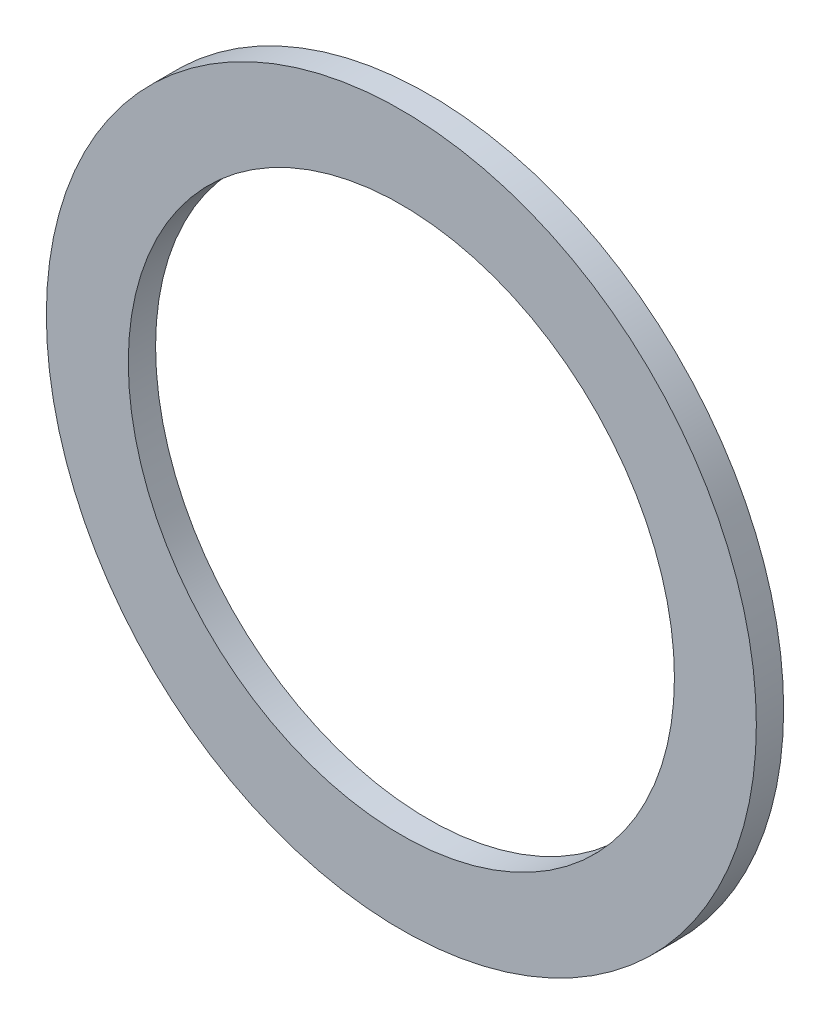
ISO-10303-21;
HEADER;
FILE_DESCRIPTION(('STEP AP214'),'2;1');
FILE_NAME('part.step','',(''),(''),'','','');
FILE_SCHEMA(('AUTOMOTIVE_DESIGN { 1 0 10303 214 1 1 1 1 }'));
ENDSEC;
DATA;
#1=APPLICATION_CONTEXT('core data for automotive mechanical design processes');
#2=APPLICATION_PROTOCOL_DEFINITION('international standard','automotive_design',2000,#1);
#3=PRODUCT_CONTEXT('',#1,'mechanical');
#4=PRODUCT('Part','Part','',(#3));
#5=PRODUCT_RELATED_PRODUCT_CATEGORY('part','',(#4));
#6=PRODUCT_DEFINITION_FORMATION('','',#4);
#7=PRODUCT_DEFINITION_CONTEXT('part definition',#1,'design');
#8=PRODUCT_DEFINITION('design','',#6,#7);
#9=PRODUCT_DEFINITION_SHAPE('','',#8);
#10=(LENGTH_UNIT() NAMED_UNIT(*) SI_UNIT(.MILLI.,.METRE.));
#11=(NAMED_UNIT(*) PLANE_ANGLE_UNIT() SI_UNIT($,.RADIAN.));
#12=(NAMED_UNIT(*) SI_UNIT($,.STERADIAN.) SOLID_ANGLE_UNIT());
#13=UNCERTAINTY_MEASURE_WITH_UNIT(LENGTH_MEASURE(1.E-05),#10,'distance_accuracy_value','');
#14=(GEOMETRIC_REPRESENTATION_CONTEXT(3) GLOBAL_UNCERTAINTY_ASSIGNED_CONTEXT((#13)) GLOBAL_UNIT_ASSIGNED_CONTEXT((#10,
#11,#12)) REPRESENTATION_CONTEXT('',''));
#15=CARTESIAN_POINT('',(0.,0.,0.));
#16=DIRECTION('',(0.,0.,1.));
#17=DIRECTION('',(1.,0.,0.));
#18=AXIS2_PLACEMENT_3D('',#15,#16,#17);
#19=CARTESIAN_POINT('',(0.,0.,0.));
#20=DIRECTION('',(0.,0.,-1.));
#21=DIRECTION('',(1.,0.,0.));
#22=AXIS2_PLACEMENT_3D('',#19,#20,#21);
#23=CYLINDRICAL_SURFACE('',#22,15.);
#24=DIRECTION('',(0.,0.,1.));
#25=VECTOR('',#24,1.);
#26=CARTESIAN_POINT('',(15.,0.,0.));
#27=LINE('',#26,#25);
#28=CARTESIAN_POINT('',(15.,0.,0.));
#29=VERTEX_POINT('',#28);
#30=CARTESIAN_POINT('',(15.,0.,1.5));
#31=VERTEX_POINT('',#30);
#32=EDGE_CURVE('E10',#29,#31,#27,.T.);
#33=ORIENTED_EDGE('',*,*,#32,.T.);
#34=CARTESIAN_POINT('',(0.,0.,1.5));
#35=DIRECTION('',(0.,0.,1.));
#36=DIRECTION('',(1.,0.,0.));
#37=AXIS2_PLACEMENT_3D('',#34,#35,#36);
#38=CIRCLE('',#37,15.);
#39=EDGE_CURVE('E24',#31,#31,#38,.T.);
#40=ORIENTED_EDGE('',*,*,#39,.T.);
#41=ORIENTED_EDGE('',*,*,#32,.F.);
#42=CARTESIAN_POINT('',(0.,0.,0.));
#43=DIRECTION('',(0.,0.,1.));
#44=DIRECTION('',(1.,0.,0.));
#45=AXIS2_PLACEMENT_3D('',#42,#43,#44);
#46=CIRCLE('',#45,15.);
#47=EDGE_CURVE('E61',#29,#29,#46,.T.);
#48=ORIENTED_EDGE('',*,*,#47,.F.);
#49=EDGE_LOOP('',(#33,#40,#41,#48));
#50=FACE_BOUND('',#49,.T.);
#51=ADVANCED_FACE('F16',(#50),#23,.F.);
#52=CARTESIAN_POINT('',(0.,0.,1.5));
#53=DIRECTION('',(0.,0.,1.));
#54=DIRECTION('',(1.,0.,0.));
#55=AXIS2_PLACEMENT_3D('',#52,#53,#54);
#56=PLANE('',#55);
#57=ORIENTED_EDGE('',*,*,#39,.F.);
#58=EDGE_LOOP('',(#57));
#59=FACE_BOUND('',#58,.T.);
#60=CARTESIAN_POINT('',(0.,0.,1.5));
#61=DIRECTION('',(0.,0.,1.));
#62=DIRECTION('',(1.,0.,0.));
#63=AXIS2_PLACEMENT_3D('',#60,#61,#62);
#64=CIRCLE('',#63,19.5);
#65=CARTESIAN_POINT('',(19.5,0.,1.5));
#66=VERTEX_POINT('',#65);
#67=EDGE_CURVE('E55',#66,#66,#64,.T.);
#68=ORIENTED_EDGE('',*,*,#67,.T.);
#69=EDGE_LOOP('',(#68));
#70=FACE_BOUND('',#69,.T.);
#71=ADVANCED_FACE('F72',(#59,#70),#56,.T.);
#72=CARTESIAN_POINT('',(0.,0.,0.));
#73=DIRECTION('',(0.,0.,1.));
#74=DIRECTION('',(1.,0.,0.));
#75=AXIS2_PLACEMENT_3D('',#72,#73,#74);
#76=PLANE('',#75);
#77=ORIENTED_EDGE('',*,*,#47,.T.);
#78=EDGE_LOOP('',(#77));
#79=FACE_BOUND('',#78,.T.);
#80=CARTESIAN_POINT('',(0.,0.,0.));
#81=DIRECTION('',(0.,0.,1.));
#82=DIRECTION('',(1.,0.,0.));
#83=AXIS2_PLACEMENT_3D('',#80,#81,#82);
#84=CIRCLE('',#83,19.5);
#85=CARTESIAN_POINT('',(19.5,0.,0.));
#86=VERTEX_POINT('',#85);
#87=EDGE_CURVE('E54',#86,#86,#84,.T.);
#88=ORIENTED_EDGE('',*,*,#87,.F.);
#89=EDGE_LOOP('',(#88));
#90=FACE_BOUND('',#89,.T.);
#91=ADVANCED_FACE('F75',(#79,#90),#76,.F.);
#92=CARTESIAN_POINT('',(0.,0.,0.));
#93=DIRECTION('',(0.,0.,-1.));
#94=DIRECTION('',(1.,0.,0.));
#95=AXIS2_PLACEMENT_3D('',#92,#93,#94);
#96=CYLINDRICAL_SURFACE('',#95,19.5);
#97=ORIENTED_EDGE('',*,*,#87,.T.);
#98=DIRECTION('',(0.,0.,1.));
#99=VECTOR('',#98,1.);
#100=CARTESIAN_POINT('',(19.5,0.,0.));
#101=LINE('',#100,#99);
#102=EDGE_CURVE('E51',#86,#66,#101,.T.);
#103=ORIENTED_EDGE('',*,*,#102,.T.);
#104=ORIENTED_EDGE('',*,*,#67,.F.);
#105=ORIENTED_EDGE('',*,*,#102,.F.);
#106=EDGE_LOOP('',(#97,#103,#104,#105));
#107=FACE_BOUND('',#106,.T.);
#108=ADVANCED_FACE('F52',(#107),#96,.T.);
#109=CLOSED_SHELL('',(#51,#71,#91,#108));
#110=MANIFOLD_SOLID_BREP('B1',#109);
#111=ADVANCED_BREP_SHAPE_REPRESENTATION('',(#18,#110),#14);
#112=SHAPE_DEFINITION_REPRESENTATION(#9,#111);
ENDSEC;
END-ISO-10303-21;
